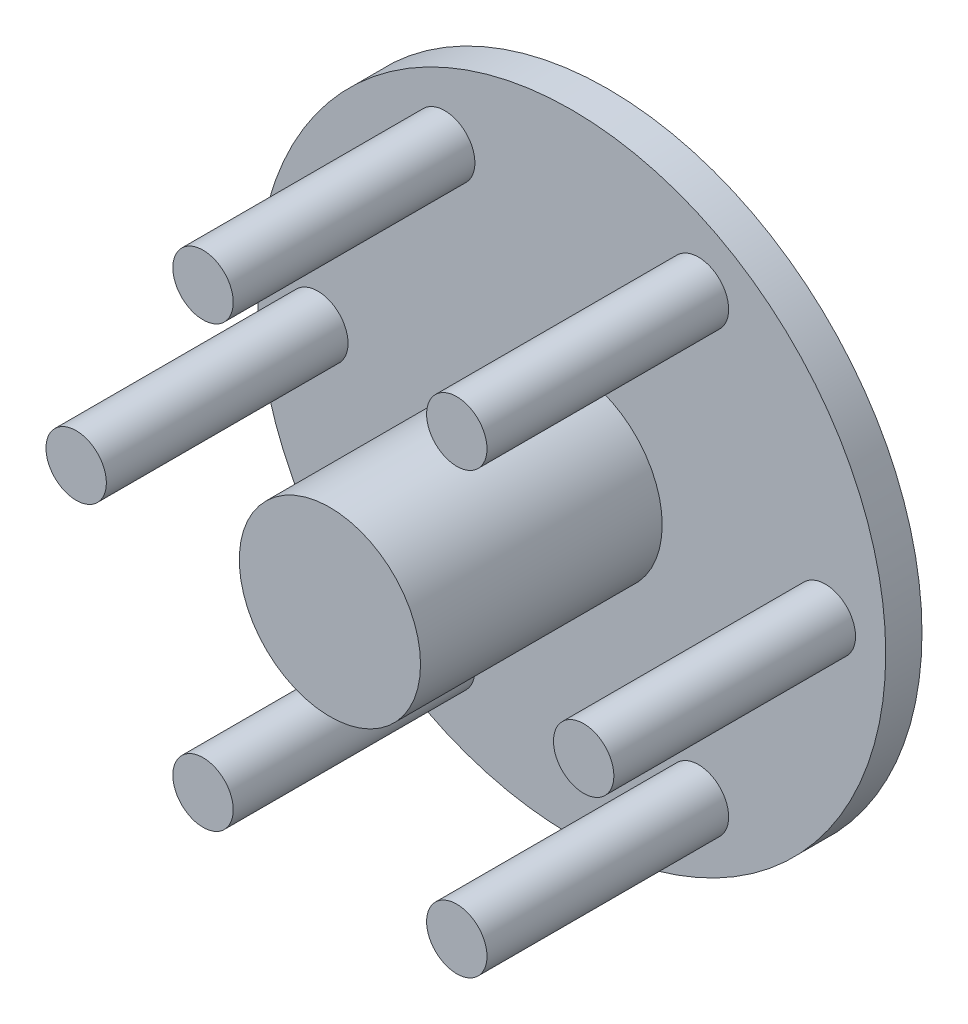
ISO-10303-21;
HEADER;
FILE_DESCRIPTION(('STEP AP214'),'2;1');
FILE_NAME('part.step','',(''),(''),'','','');
FILE_SCHEMA(('AUTOMOTIVE_DESIGN { 1 0 10303 214 1 1 1 1 }'));
ENDSEC;
DATA;
#1=APPLICATION_CONTEXT('core data for automotive mechanical design processes');
#2=APPLICATION_PROTOCOL_DEFINITION('international standard','automotive_design',2000,#1);
#3=PRODUCT_CONTEXT('',#1,'mechanical');
#4=PRODUCT('Part','Part','',(#3));
#5=PRODUCT_RELATED_PRODUCT_CATEGORY('part','',(#4));
#6=PRODUCT_DEFINITION_FORMATION('','',#4);
#7=PRODUCT_DEFINITION_CONTEXT('part definition',#1,'design');
#8=PRODUCT_DEFINITION('design','',#6,#7);
#9=PRODUCT_DEFINITION_SHAPE('','',#8);
#10=(LENGTH_UNIT() NAMED_UNIT(*) SI_UNIT(.MILLI.,.METRE.));
#11=(NAMED_UNIT(*) PLANE_ANGLE_UNIT() SI_UNIT($,.RADIAN.));
#12=(NAMED_UNIT(*) SI_UNIT($,.STERADIAN.) SOLID_ANGLE_UNIT());
#13=UNCERTAINTY_MEASURE_WITH_UNIT(LENGTH_MEASURE(1.E-05),#10,'distance_accuracy_value','');
#14=(GEOMETRIC_REPRESENTATION_CONTEXT(3) GLOBAL_UNCERTAINTY_ASSIGNED_CONTEXT((#13)) GLOBAL_UNIT_ASSIGNED_CONTEXT((#10,
#11,#12)) REPRESENTATION_CONTEXT('',''));
#15=CARTESIAN_POINT('',(0.,0.,0.));
#16=DIRECTION('',(0.,0.,1.));
#17=DIRECTION('',(1.,0.,0.));
#18=AXIS2_PLACEMENT_3D('',#15,#16,#17);
#19=CARTESIAN_POINT('',(0.,0.,-3.));
#20=DIRECTION('',(0.,0.,1.));
#21=DIRECTION('',(1.,0.,0.));
#22=AXIS2_PLACEMENT_3D('',#19,#20,#21);
#23=CYLINDRICAL_SURFACE('',#22,26.);
#24=CARTESIAN_POINT('',(0.,0.,-3.));
#25=DIRECTION('',(0.,0.,1.));
#26=DIRECTION('',(1.,0.,0.));
#27=AXIS2_PLACEMENT_3D('',#24,#25,#26);
#28=CIRCLE('',#27,26.);
#29=CARTESIAN_POINT('',(26.,0.,-3.));
#30=VERTEX_POINT('',#29);
#31=EDGE_CURVE('E10',#30,#30,#28,.T.);
#32=ORIENTED_EDGE('',*,*,#31,.T.);
#33=EDGE_LOOP('',(#32));
#34=FACE_BOUND('',#33,.T.);
#35=CARTESIAN_POINT('',(0.,0.,0.));
#36=DIRECTION('',(0.,0.,1.));
#37=DIRECTION('',(1.,0.,0.));
#38=AXIS2_PLACEMENT_3D('',#35,#36,#37);
#39=CIRCLE('',#38,26.);
#40=CARTESIAN_POINT('',(26.,0.,0.));
#41=VERTEX_POINT('',#40);
#42=EDGE_CURVE('E44',#41,#41,#39,.T.);
#43=ORIENTED_EDGE('',*,*,#42,.F.);
#44=EDGE_LOOP('',(#43));
#45=FACE_BOUND('',#44,.T.);
#46=ADVANCED_FACE('F41',(#34,#45),#23,.T.);
#47=CARTESIAN_POINT('',(0.,0.,-3.));
#48=DIRECTION('',(0.,0.,1.));
#49=DIRECTION('',(1.,0.,0.));
#50=AXIS2_PLACEMENT_3D('',#47,#48,#49);
#51=PLANE('',#50);
#52=ORIENTED_EDGE('',*,*,#31,.F.);
#53=EDGE_LOOP('',(#52));
#54=FACE_BOUND('',#53,.T.);
#55=ADVANCED_FACE('F108',(#54),#51,.F.);
#56=CARTESIAN_POINT('',(0.,0.,0.));
#57=DIRECTION('',(0.,0.,1.));
#58=DIRECTION('',(1.,0.,0.));
#59=AXIS2_PLACEMENT_3D('',#56,#57,#58);
#60=PLANE('',#59);
#61=CARTESIAN_POINT('',(0.,0.,0.));
#62=DIRECTION('',(0.,0.,1.));
#63=DIRECTION('',(1.,0.,0.));
#64=AXIS2_PLACEMENT_3D('',#61,#62,#63);
#65=CIRCLE('',#64,7.5);
#66=CARTESIAN_POINT('',(7.5,0.,0.));
#67=VERTEX_POINT('',#66);
#68=EDGE_CURVE('E89',#67,#67,#65,.T.);
#69=ORIENTED_EDGE('',*,*,#68,.F.);
#70=EDGE_LOOP('',(#69));
#71=FACE_BOUND('',#70,.T.);
#72=CARTESIAN_POINT('',(-10.5,-18.1865334794732,0.));
#73=DIRECTION('',(0.,0.,1.));
#74=DIRECTION('',(1.,0.,0.));
#75=AXIS2_PLACEMENT_3D('',#72,#73,#74);
#76=CIRCLE('',#75,2.5);
#77=CARTESIAN_POINT('',(-8.,-18.1865334794732,0.));
#78=VERTEX_POINT('',#77);
#79=EDGE_CURVE('E83',#78,#78,#76,.T.);
#80=ORIENTED_EDGE('',*,*,#79,.F.);
#81=EDGE_LOOP('',(#80));
#82=FACE_BOUND('',#81,.T.);
#83=CARTESIAN_POINT('',(10.5,-18.1865334794732,0.));
#84=DIRECTION('',(0.,0.,1.));
#85=DIRECTION('',(1.,0.,0.));
#86=AXIS2_PLACEMENT_3D('',#83,#84,#85);
#87=CIRCLE('',#86,2.5);
#88=CARTESIAN_POINT('',(13.,-18.1865334794732,0.));
#89=VERTEX_POINT('',#88);
#90=EDGE_CURVE('E77',#89,#89,#87,.T.);
#91=ORIENTED_EDGE('',*,*,#90,.F.);
#92=EDGE_LOOP('',(#91));
#93=FACE_BOUND('',#92,.T.);
#94=CARTESIAN_POINT('',(21.,0.,0.));
#95=DIRECTION('',(0.,0.,1.));
#96=DIRECTION('',(1.,0.,0.));
#97=AXIS2_PLACEMENT_3D('',#94,#95,#96);
#98=CIRCLE('',#97,2.5);
#99=CARTESIAN_POINT('',(23.5,0.,0.));
#100=VERTEX_POINT('',#99);
#101=EDGE_CURVE('E71',#100,#100,#98,.T.);
#102=ORIENTED_EDGE('',*,*,#101,.F.);
#103=EDGE_LOOP('',(#102));
#104=FACE_BOUND('',#103,.T.);
#105=CARTESIAN_POINT('',(10.5,18.1865334794732,0.));
#106=DIRECTION('',(0.,0.,1.));
#107=DIRECTION('',(1.,0.,0.));
#108=AXIS2_PLACEMENT_3D('',#105,#106,#107);
#109=CIRCLE('',#108,2.5);
#110=CARTESIAN_POINT('',(13.,18.1865334794732,0.));
#111=VERTEX_POINT('',#110);
#112=EDGE_CURVE('E65',#111,#111,#109,.T.);
#113=ORIENTED_EDGE('',*,*,#112,.F.);
#114=EDGE_LOOP('',(#113));
#115=FACE_BOUND('',#114,.T.);
#116=CARTESIAN_POINT('',(-10.5,18.1865334794732,0.));
#117=DIRECTION('',(0.,0.,1.));
#118=DIRECTION('',(1.,0.,0.));
#119=AXIS2_PLACEMENT_3D('',#116,#117,#118);
#120=CIRCLE('',#119,2.5);
#121=CARTESIAN_POINT('',(-8.00000000000001,18.1865334794732,0.));
#122=VERTEX_POINT('',#121);
#123=EDGE_CURVE('E59',#122,#122,#120,.T.);
#124=ORIENTED_EDGE('',*,*,#123,.F.);
#125=EDGE_LOOP('',(#124));
#126=FACE_BOUND('',#125,.T.);
#127=CARTESIAN_POINT('',(-21.,0.,0.));
#128=DIRECTION('',(0.,0.,1.));
#129=DIRECTION('',(1.,0.,0.));
#130=AXIS2_PLACEMENT_3D('',#127,#128,#129);
#131=CIRCLE('',#130,2.5);
#132=CARTESIAN_POINT('',(-18.5,0.,0.));
#133=VERTEX_POINT('',#132);
#134=EDGE_CURVE('E53',#133,#133,#131,.T.);
#135=ORIENTED_EDGE('',*,*,#134,.F.);
#136=EDGE_LOOP('',(#135));
#137=FACE_BOUND('',#136,.T.);
#138=ORIENTED_EDGE('',*,*,#42,.T.);
#139=EDGE_LOOP('',(#138));
#140=FACE_BOUND('',#139,.T.);
#141=ADVANCED_FACE('F104',(#71,#82,#93,#104,#115,#126,#137,#140),#60,.T.);
#142=CARTESIAN_POINT('',(-21.,0.,20.));
#143=DIRECTION('',(0.,0.,-1.));
#144=DIRECTION('',(-1.,0.,0.));
#145=AXIS2_PLACEMENT_3D('',#142,#143,#144);
#146=CYLINDRICAL_SURFACE('',#145,2.5);
#147=CARTESIAN_POINT('',(-21.,0.,20.));
#148=DIRECTION('',(0.,0.,1.));
#149=DIRECTION('',(1.,0.,0.));
#150=AXIS2_PLACEMENT_3D('',#147,#148,#149);
#151=CIRCLE('',#150,2.5);
#152=CARTESIAN_POINT('',(-18.5,0.,20.));
#153=VERTEX_POINT('',#152);
#154=EDGE_CURVE('E51',#153,#153,#151,.T.);
#155=ORIENTED_EDGE('',*,*,#154,.F.);
#156=EDGE_LOOP('',(#155));
#157=FACE_BOUND('',#156,.T.);
#158=ORIENTED_EDGE('',*,*,#134,.T.);
#159=EDGE_LOOP('',(#158));
#160=FACE_BOUND('',#159,.T.);
#161=ADVANCED_FACE('F107',(#157,#160),#146,.T.);
#162=CARTESIAN_POINT('',(0.,0.,20.));
#163=DIRECTION('',(0.,0.,1.));
#164=DIRECTION('',(1.,0.,0.));
#165=AXIS2_PLACEMENT_3D('',#162,#163,#164);
#166=PLANE('',#165);
#167=ORIENTED_EDGE('',*,*,#154,.T.);
#168=EDGE_LOOP('',(#167));
#169=FACE_BOUND('',#168,.T.);
#170=ADVANCED_FACE('F134',(#169),#166,.T.);
#171=CARTESIAN_POINT('',(-10.5,18.1865334794732,20.));
#172=DIRECTION('',(0.,0.,-1.));
#173=DIRECTION('',(-1.,0.,0.));
#174=AXIS2_PLACEMENT_3D('',#171,#172,#173);
#175=CYLINDRICAL_SURFACE('',#174,2.5);
#176=CARTESIAN_POINT('',(-10.5,18.1865334794732,20.));
#177=DIRECTION('',(0.,0.,1.));
#178=DIRECTION('',(1.,0.,0.));
#179=AXIS2_PLACEMENT_3D('',#176,#177,#178);
#180=CIRCLE('',#179,2.5);
#181=CARTESIAN_POINT('',(-8.00000000000001,18.1865334794732,20.));
#182=VERTEX_POINT('',#181);
#183=EDGE_CURVE('E56',#182,#182,#180,.T.);
#184=ORIENTED_EDGE('',*,*,#183,.F.);
#185=EDGE_LOOP('',(#184));
#186=FACE_BOUND('',#185,.T.);
#187=ORIENTED_EDGE('',*,*,#123,.T.);
#188=EDGE_LOOP('',(#187));
#189=FACE_BOUND('',#188,.T.);
#190=ADVANCED_FACE('F138',(#186,#189),#175,.T.);
#191=CARTESIAN_POINT('',(0.,0.,20.));
#192=DIRECTION('',(0.,0.,1.));
#193=DIRECTION('',(1.,0.,0.));
#194=AXIS2_PLACEMENT_3D('',#191,#192,#193);
#195=PLANE('',#194);
#196=ORIENTED_EDGE('',*,*,#183,.T.);
#197=EDGE_LOOP('',(#196));
#198=FACE_BOUND('',#197,.T.);
#199=ADVANCED_FACE('F142',(#198),#195,.T.);
#200=CARTESIAN_POINT('',(10.5,18.1865334794732,20.));
#201=DIRECTION('',(0.,0.,-1.));
#202=DIRECTION('',(-1.,0.,0.));
#203=AXIS2_PLACEMENT_3D('',#200,#201,#202);
#204=CYLINDRICAL_SURFACE('',#203,2.5);
#205=CARTESIAN_POINT('',(10.5,18.1865334794732,20.));
#206=DIRECTION('',(0.,0.,1.));
#207=DIRECTION('',(1.,0.,0.));
#208=AXIS2_PLACEMENT_3D('',#205,#206,#207);
#209=CIRCLE('',#208,2.5);
#210=CARTESIAN_POINT('',(13.,18.1865334794732,20.));
#211=VERTEX_POINT('',#210);
#212=EDGE_CURVE('E62',#211,#211,#209,.T.);
#213=ORIENTED_EDGE('',*,*,#212,.F.);
#214=EDGE_LOOP('',(#213));
#215=FACE_BOUND('',#214,.T.);
#216=ORIENTED_EDGE('',*,*,#112,.T.);
#217=EDGE_LOOP('',(#216));
#218=FACE_BOUND('',#217,.T.);
#219=ADVANCED_FACE('F146',(#215,#218),#204,.T.);
#220=CARTESIAN_POINT('',(0.,0.,20.));
#221=DIRECTION('',(0.,0.,1.));
#222=DIRECTION('',(1.,0.,0.));
#223=AXIS2_PLACEMENT_3D('',#220,#221,#222);
#224=PLANE('',#223);
#225=ORIENTED_EDGE('',*,*,#212,.T.);
#226=EDGE_LOOP('',(#225));
#227=FACE_BOUND('',#226,.T.);
#228=ADVANCED_FACE('F150',(#227),#224,.T.);
#229=CARTESIAN_POINT('',(21.,0.,20.));
#230=DIRECTION('',(0.,0.,-1.));
#231=DIRECTION('',(-1.,0.,0.));
#232=AXIS2_PLACEMENT_3D('',#229,#230,#231);
#233=CYLINDRICAL_SURFACE('',#232,2.5);
#234=CARTESIAN_POINT('',(21.,0.,20.));
#235=DIRECTION('',(0.,0.,1.));
#236=DIRECTION('',(1.,0.,0.));
#237=AXIS2_PLACEMENT_3D('',#234,#235,#236);
#238=CIRCLE('',#237,2.5);
#239=CARTESIAN_POINT('',(23.5,0.,20.));
#240=VERTEX_POINT('',#239);
#241=EDGE_CURVE('E68',#240,#240,#238,.T.);
#242=ORIENTED_EDGE('',*,*,#241,.F.);
#243=EDGE_LOOP('',(#242));
#244=FACE_BOUND('',#243,.T.);
#245=ORIENTED_EDGE('',*,*,#101,.T.);
#246=EDGE_LOOP('',(#245));
#247=FACE_BOUND('',#246,.T.);
#248=ADVANCED_FACE('F154',(#244,#247),#233,.T.);
#249=CARTESIAN_POINT('',(0.,0.,20.));
#250=DIRECTION('',(0.,0.,1.));
#251=DIRECTION('',(1.,0.,0.));
#252=AXIS2_PLACEMENT_3D('',#249,#250,#251);
#253=PLANE('',#252);
#254=ORIENTED_EDGE('',*,*,#241,.T.);
#255=EDGE_LOOP('',(#254));
#256=FACE_BOUND('',#255,.T.);
#257=ADVANCED_FACE('F158',(#256),#253,.T.);
#258=CARTESIAN_POINT('',(10.5,-18.1865334794732,20.));
#259=DIRECTION('',(0.,0.,-1.));
#260=DIRECTION('',(-1.,0.,0.));
#261=AXIS2_PLACEMENT_3D('',#258,#259,#260);
#262=CYLINDRICAL_SURFACE('',#261,2.5);
#263=CARTESIAN_POINT('',(10.5,-18.1865334794732,20.));
#264=DIRECTION('',(0.,0.,1.));
#265=DIRECTION('',(1.,0.,0.));
#266=AXIS2_PLACEMENT_3D('',#263,#264,#265);
#267=CIRCLE('',#266,2.5);
#268=CARTESIAN_POINT('',(13.,-18.1865334794732,20.));
#269=VERTEX_POINT('',#268);
#270=EDGE_CURVE('E74',#269,#269,#267,.T.);
#271=ORIENTED_EDGE('',*,*,#270,.F.);
#272=EDGE_LOOP('',(#271));
#273=FACE_BOUND('',#272,.T.);
#274=ORIENTED_EDGE('',*,*,#90,.T.);
#275=EDGE_LOOP('',(#274));
#276=FACE_BOUND('',#275,.T.);
#277=ADVANCED_FACE('F162',(#273,#276),#262,.T.);
#278=CARTESIAN_POINT('',(0.,0.,20.));
#279=DIRECTION('',(0.,0.,1.));
#280=DIRECTION('',(1.,0.,0.));
#281=AXIS2_PLACEMENT_3D('',#278,#279,#280);
#282=PLANE('',#281);
#283=ORIENTED_EDGE('',*,*,#270,.T.);
#284=EDGE_LOOP('',(#283));
#285=FACE_BOUND('',#284,.T.);
#286=ADVANCED_FACE('F166',(#285),#282,.T.);
#287=CARTESIAN_POINT('',(-10.5,-18.1865334794732,20.));
#288=DIRECTION('',(0.,0.,-1.));
#289=DIRECTION('',(-1.,0.,0.));
#290=AXIS2_PLACEMENT_3D('',#287,#288,#289);
#291=CYLINDRICAL_SURFACE('',#290,2.5);
#292=CARTESIAN_POINT('',(-10.5,-18.1865334794732,20.));
#293=DIRECTION('',(0.,0.,1.));
#294=DIRECTION('',(1.,0.,0.));
#295=AXIS2_PLACEMENT_3D('',#292,#293,#294);
#296=CIRCLE('',#295,2.5);
#297=CARTESIAN_POINT('',(-8.,-18.1865334794732,20.));
#298=VERTEX_POINT('',#297);
#299=EDGE_CURVE('E80',#298,#298,#296,.T.);
#300=ORIENTED_EDGE('',*,*,#299,.F.);
#301=EDGE_LOOP('',(#300));
#302=FACE_BOUND('',#301,.T.);
#303=ORIENTED_EDGE('',*,*,#79,.T.);
#304=EDGE_LOOP('',(#303));
#305=FACE_BOUND('',#304,.T.);
#306=ADVANCED_FACE('F170',(#302,#305),#291,.T.);
#307=CARTESIAN_POINT('',(0.,0.,20.));
#308=DIRECTION('',(0.,0.,1.));
#309=DIRECTION('',(1.,0.,0.));
#310=AXIS2_PLACEMENT_3D('',#307,#308,#309);
#311=PLANE('',#310);
#312=ORIENTED_EDGE('',*,*,#299,.T.);
#313=EDGE_LOOP('',(#312));
#314=FACE_BOUND('',#313,.T.);
#315=ADVANCED_FACE('F100',(#314),#311,.T.);
#316=CARTESIAN_POINT('',(0.,0.,20.));
#317=DIRECTION('',(0.,0.,-1.));
#318=DIRECTION('',(-1.,0.,0.));
#319=AXIS2_PLACEMENT_3D('',#316,#317,#318);
#320=CYLINDRICAL_SURFACE('',#319,7.5);
#321=CARTESIAN_POINT('',(0.,0.,20.));
#322=DIRECTION('',(0.,0.,1.));
#323=DIRECTION('',(1.,0.,0.));
#324=AXIS2_PLACEMENT_3D('',#321,#322,#323);
#325=CIRCLE('',#324,7.5);
#326=CARTESIAN_POINT('',(7.5,0.,20.));
#327=VERTEX_POINT('',#326);
#328=EDGE_CURVE('E86',#327,#327,#325,.T.);
#329=ORIENTED_EDGE('',*,*,#328,.F.);
#330=EDGE_LOOP('',(#329));
#331=FACE_BOUND('',#330,.T.);
#332=ORIENTED_EDGE('',*,*,#68,.T.);
#333=EDGE_LOOP('',(#332));
#334=FACE_BOUND('',#333,.T.);
#335=ADVANCED_FACE('F97',(#331,#334),#320,.T.);
#336=CARTESIAN_POINT('',(0.,0.,20.));
#337=DIRECTION('',(0.,0.,1.));
#338=DIRECTION('',(1.,0.,0.));
#339=AXIS2_PLACEMENT_3D('',#336,#337,#338);
#340=PLANE('',#339);
#341=ORIENTED_EDGE('',*,*,#328,.T.);
#342=EDGE_LOOP('',(#341));
#343=FACE_BOUND('',#342,.T.);
#344=ADVANCED_FACE('F95',(#343),#340,.T.);
#345=CLOSED_SHELL('',(#46,#55,#141,#161,#170,#190,#199,#219,#228,#248,#257,#277,#286,#306,#315,
#335,#344));
#346=MANIFOLD_SOLID_BREP('B2',#345);
#347=ADVANCED_BREP_SHAPE_REPRESENTATION('',(#18,#346),#14);
#348=SHAPE_DEFINITION_REPRESENTATION(#9,#347);
ENDSEC;
END-ISO-10303-21;
